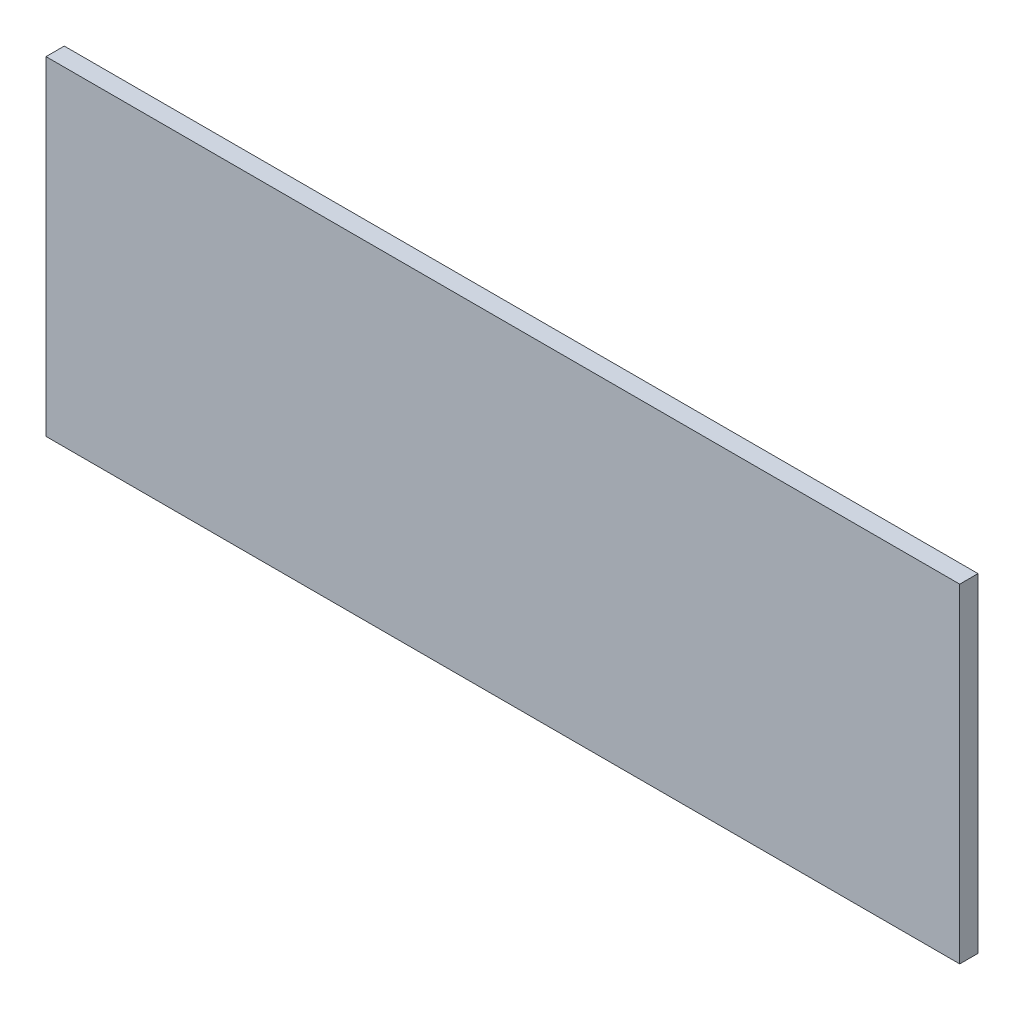
ISO-10303-21;
HEADER;
FILE_DESCRIPTION(('STEP AP214'),'2;1');
FILE_NAME('part.step','',(''),(''),'','','');
FILE_SCHEMA(('AUTOMOTIVE_DESIGN { 1 0 10303 214 1 1 1 1 }'));
ENDSEC;
DATA;
#1=APPLICATION_CONTEXT('core data for automotive mechanical design processes');
#2=APPLICATION_PROTOCOL_DEFINITION('international standard','automotive_design',2000,#1);
#3=PRODUCT_CONTEXT('',#1,'mechanical');
#4=PRODUCT('Part','Part','',(#3));
#5=PRODUCT_RELATED_PRODUCT_CATEGORY('part','',(#4));
#6=PRODUCT_DEFINITION_FORMATION('','',#4);
#7=PRODUCT_DEFINITION_CONTEXT('part definition',#1,'design');
#8=PRODUCT_DEFINITION('design','',#6,#7);
#9=PRODUCT_DEFINITION_SHAPE('','',#8);
#10=(LENGTH_UNIT() NAMED_UNIT(*) SI_UNIT(.MILLI.,.METRE.));
#11=(NAMED_UNIT(*) PLANE_ANGLE_UNIT() SI_UNIT($,.RADIAN.));
#12=(NAMED_UNIT(*) SI_UNIT($,.STERADIAN.) SOLID_ANGLE_UNIT());
#13=UNCERTAINTY_MEASURE_WITH_UNIT(LENGTH_MEASURE(1.E-05),#10,'distance_accuracy_value','');
#14=(GEOMETRIC_REPRESENTATION_CONTEXT(3) GLOBAL_UNCERTAINTY_ASSIGNED_CONTEXT((#13)) GLOBAL_UNIT_ASSIGNED_CONTEXT((#10,
#11,#12)) REPRESENTATION_CONTEXT('',''));
#15=CARTESIAN_POINT('',(0.,0.,0.));
#16=DIRECTION('',(0.,0.,1.));
#17=DIRECTION('',(1.,0.,0.));
#18=AXIS2_PLACEMENT_3D('',#15,#16,#17);
#19=CARTESIAN_POINT('',(-125.,-45.,5.));
#20=DIRECTION('',(1.,0.,0.));
#21=DIRECTION('',(0.,0.,-1.));
#22=AXIS2_PLACEMENT_3D('',#19,#20,#21);
#23=PLANE('',#22);
#24=DIRECTION('',(0.,-1.,0.));
#25=VECTOR('',#24,1.);
#26=CARTESIAN_POINT('',(-125.,-45.,0.));
#27=LINE('',#26,#25);
#28=CARTESIAN_POINT('',(-125.,45.,0.));
#29=VERTEX_POINT('',#28);
#30=CARTESIAN_POINT('',(-125.,-45.,0.));
#31=VERTEX_POINT('',#30);
#32=EDGE_CURVE('E96',#29,#31,#27,.T.);
#33=ORIENTED_EDGE('',*,*,#32,.T.);
#34=DIRECTION('',(0.,0.,-1.));
#35=VECTOR('',#34,1.);
#36=CARTESIAN_POINT('',(-125.,-45.,5.));
#37=LINE('',#36,#35);
#38=CARTESIAN_POINT('',(-125.,-45.,5.));
#39=VERTEX_POINT('',#38);
#40=EDGE_CURVE('E11',#39,#31,#37,.T.);
#41=ORIENTED_EDGE('',*,*,#40,.F.);
#42=DIRECTION('',(0.,-1.,0.));
#43=VECTOR('',#42,1.);
#44=CARTESIAN_POINT('',(-125.,-45.,5.));
#45=LINE('',#44,#43);
#46=CARTESIAN_POINT('',(-125.,45.,5.));
#47=VERTEX_POINT('',#46);
#48=EDGE_CURVE('E84',#47,#39,#45,.T.);
#49=ORIENTED_EDGE('',*,*,#48,.F.);
#50=DIRECTION('',(0.,0.,-1.));
#51=VECTOR('',#50,1.);
#52=CARTESIAN_POINT('',(-125.,45.,5.));
#53=LINE('',#52,#51);
#54=EDGE_CURVE('E92',#47,#29,#53,.T.);
#55=ORIENTED_EDGE('',*,*,#54,.T.);
#56=EDGE_LOOP('',(#33,#41,#49,#55));
#57=FACE_BOUND('',#56,.T.);
#58=ADVANCED_FACE('F33',(#57),#23,.F.);
#59=CARTESIAN_POINT('',(125.,-45.,5.));
#60=DIRECTION('',(0.,1.,0.));
#61=DIRECTION('',(-1.,0.,0.));
#62=AXIS2_PLACEMENT_3D('',#59,#60,#61);
#63=PLANE('',#62);
#64=DIRECTION('',(1.,0.,0.));
#65=VECTOR('',#64,1.);
#66=CARTESIAN_POINT('',(125.,-45.,0.));
#67=LINE('',#66,#65);
#68=CARTESIAN_POINT('',(125.,-45.,0.));
#69=VERTEX_POINT('',#68);
#70=EDGE_CURVE('E88',#31,#69,#67,.T.);
#71=ORIENTED_EDGE('',*,*,#70,.T.);
#72=DIRECTION('',(0.,0.,-1.));
#73=VECTOR('',#72,1.);
#74=CARTESIAN_POINT('',(125.,-45.,5.));
#75=LINE('',#74,#73);
#76=CARTESIAN_POINT('',(125.,-45.,5.));
#77=VERTEX_POINT('',#76);
#78=EDGE_CURVE('E41',#77,#69,#75,.T.);
#79=ORIENTED_EDGE('',*,*,#78,.F.);
#80=DIRECTION('',(1.,0.,0.));
#81=VECTOR('',#80,1.);
#82=CARTESIAN_POINT('',(125.,-45.,5.));
#83=LINE('',#82,#81);
#84=EDGE_CURVE('E79',#39,#77,#83,.T.);
#85=ORIENTED_EDGE('',*,*,#84,.F.);
#86=ORIENTED_EDGE('',*,*,#40,.T.);
#87=EDGE_LOOP('',(#71,#79,#85,#86));
#88=FACE_BOUND('',#87,.T.);
#89=ADVANCED_FACE('F87',(#88),#63,.F.);
#90=CARTESIAN_POINT('',(125.,-45.,5.));
#91=DIRECTION('',(-1.,0.,0.));
#92=DIRECTION('',(0.,0.,1.));
#93=AXIS2_PLACEMENT_3D('',#90,#91,#92);
#94=PLANE('',#93);
#95=DIRECTION('',(0.,1.,0.));
#96=VECTOR('',#95,1.);
#97=CARTESIAN_POINT('',(125.,-45.,0.));
#98=LINE('',#97,#96);
#99=CARTESIAN_POINT('',(125.,45.,0.));
#100=VERTEX_POINT('',#99);
#101=EDGE_CURVE('E66',#69,#100,#98,.T.);
#102=ORIENTED_EDGE('',*,*,#101,.T.);
#103=DIRECTION('',(0.,0.,-1.));
#104=VECTOR('',#103,1.);
#105=CARTESIAN_POINT('',(125.,45.,5.));
#106=LINE('',#105,#104);
#107=CARTESIAN_POINT('',(125.,45.,5.));
#108=VERTEX_POINT('',#107);
#109=EDGE_CURVE('E89',#108,#100,#106,.T.);
#110=ORIENTED_EDGE('',*,*,#109,.F.);
#111=DIRECTION('',(0.,1.,0.));
#112=VECTOR('',#111,1.);
#113=CARTESIAN_POINT('',(125.,-45.,5.));
#114=LINE('',#113,#112);
#115=EDGE_CURVE('E82',#77,#108,#114,.T.);
#116=ORIENTED_EDGE('',*,*,#115,.F.);
#117=ORIENTED_EDGE('',*,*,#78,.T.);
#118=EDGE_LOOP('',(#102,#110,#116,#117));
#119=FACE_BOUND('',#118,.T.);
#120=ADVANCED_FACE('F90',(#119),#94,.F.);
#121=CARTESIAN_POINT('',(125.,45.,5.));
#122=DIRECTION('',(0.,-1.,0.));
#123=DIRECTION('',(1.,0.,0.));
#124=AXIS2_PLACEMENT_3D('',#121,#122,#123);
#125=PLANE('',#124);
#126=DIRECTION('',(-1.,0.,0.));
#127=VECTOR('',#126,1.);
#128=CARTESIAN_POINT('',(125.,45.,0.));
#129=LINE('',#128,#127);
#130=EDGE_CURVE('E72',#100,#29,#129,.T.);
#131=ORIENTED_EDGE('',*,*,#130,.T.);
#132=ORIENTED_EDGE('',*,*,#54,.F.);
#133=DIRECTION('',(-1.,0.,0.));
#134=VECTOR('',#133,1.);
#135=CARTESIAN_POINT('',(125.,45.,5.));
#136=LINE('',#135,#134);
#137=EDGE_CURVE('E49',#108,#47,#136,.T.);
#138=ORIENTED_EDGE('',*,*,#137,.F.);
#139=ORIENTED_EDGE('',*,*,#109,.T.);
#140=EDGE_LOOP('',(#131,#132,#138,#139));
#141=FACE_BOUND('',#140,.T.);
#142=ADVANCED_FACE('F103',(#141),#125,.F.);
#143=CARTESIAN_POINT('',(0.,0.,5.));
#144=DIRECTION('',(0.,0.,1.));
#145=DIRECTION('',(1.,0.,0.));
#146=AXIS2_PLACEMENT_3D('',#143,#144,#145);
#147=PLANE('',#146);
#148=ORIENTED_EDGE('',*,*,#48,.T.);
#149=ORIENTED_EDGE('',*,*,#84,.T.);
#150=ORIENTED_EDGE('',*,*,#115,.T.);
#151=ORIENTED_EDGE('',*,*,#137,.T.);
#152=EDGE_LOOP('',(#148,#149,#150,#151));
#153=FACE_BOUND('',#152,.T.);
#154=ADVANCED_FACE('F80',(#153),#147,.T.);
#155=CARTESIAN_POINT('',(0.,0.,0.));
#156=DIRECTION('',(0.,0.,1.));
#157=DIRECTION('',(1.,0.,0.));
#158=AXIS2_PLACEMENT_3D('',#155,#156,#157);
#159=PLANE('',#158);
#160=ORIENTED_EDGE('',*,*,#32,.F.);
#161=ORIENTED_EDGE('',*,*,#130,.F.);
#162=ORIENTED_EDGE('',*,*,#101,.F.);
#163=ORIENTED_EDGE('',*,*,#70,.F.);
#164=EDGE_LOOP('',(#160,#161,#162,#163));
#165=FACE_BOUND('',#164,.T.);
#166=ADVANCED_FACE('F106',(#165),#159,.F.);
#167=CLOSED_SHELL('',(#58,#89,#120,#142,#154,#166));
#168=MANIFOLD_SOLID_BREP('B2',#167);
#169=ADVANCED_BREP_SHAPE_REPRESENTATION('',(#18,#168),#14);
#170=SHAPE_DEFINITION_REPRESENTATION(#9,#169);
ENDSEC;
END-ISO-10303-21;
